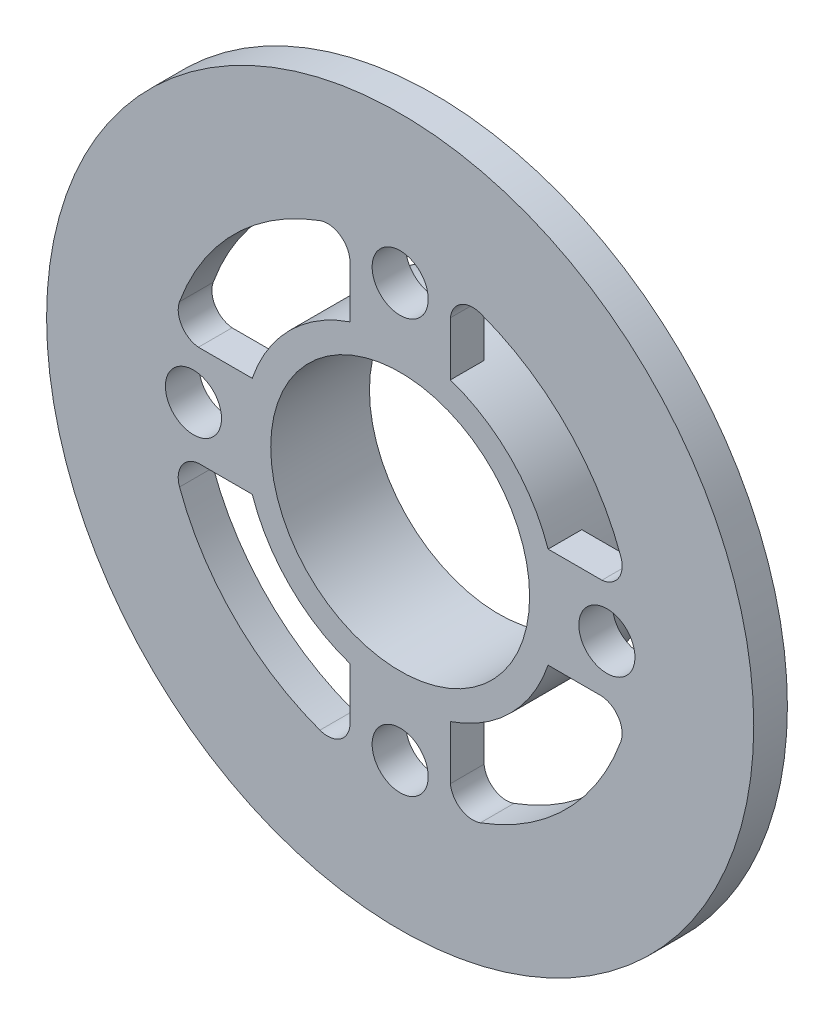
ISO-10303-21;
HEADER;
FILE_DESCRIPTION(('STEP AP214'),'2;1');
FILE_NAME('part.step','',(''),(''),'','','');
FILE_SCHEMA(('AUTOMOTIVE_DESIGN { 1 0 10303 214 1 1 1 1 }'));
ENDSEC;
DATA;
#1=APPLICATION_CONTEXT('core data for automotive mechanical design processes');
#2=APPLICATION_PROTOCOL_DEFINITION('international standard','automotive_design',2000,#1);
#3=PRODUCT_CONTEXT('',#1,'mechanical');
#4=PRODUCT('Part','Part','',(#3));
#5=PRODUCT_RELATED_PRODUCT_CATEGORY('part','',(#4));
#6=PRODUCT_DEFINITION_FORMATION('','',#4);
#7=PRODUCT_DEFINITION_CONTEXT('part definition',#1,'design');
#8=PRODUCT_DEFINITION('design','',#6,#7);
#9=PRODUCT_DEFINITION_SHAPE('','',#8);
#10=(LENGTH_UNIT() NAMED_UNIT(*) SI_UNIT(.MILLI.,.METRE.));
#11=(NAMED_UNIT(*) PLANE_ANGLE_UNIT() SI_UNIT($,.RADIAN.));
#12=(NAMED_UNIT(*) SI_UNIT($,.STERADIAN.) SOLID_ANGLE_UNIT());
#13=UNCERTAINTY_MEASURE_WITH_UNIT(LENGTH_MEASURE(1.E-05),#10,'distance_accuracy_value','');
#14=(GEOMETRIC_REPRESENTATION_CONTEXT(3) GLOBAL_UNCERTAINTY_ASSIGNED_CONTEXT((#13)) GLOBAL_UNIT_ASSIGNED_CONTEXT((#10,
#11,#12)) REPRESENTATION_CONTEXT('',''));
#15=CARTESIAN_POINT('',(0.,0.,0.));
#16=DIRECTION('',(0.,0.,1.));
#17=DIRECTION('',(1.,0.,0.));
#18=AXIS2_PLACEMENT_3D('',#15,#16,#17);
#19=CARTESIAN_POINT('',(0.,0.,3.));
#20=DIRECTION('',(0.,0.,1.));
#21=DIRECTION('',(1.,0.,0.));
#22=AXIS2_PLACEMENT_3D('',#19,#20,#21);
#23=PLANE('',#22);
#24=DIRECTION('',(0.,-1.,0.));
#25=VECTOR('',#24,1.);
#26=CARTESIAN_POINT('',(-4.47815058329456,17.9820921615691,3.));
#27=LINE('',#26,#25);
#28=CARTESIAN_POINT('',(-4.47815058329407,17.9820921615698,3.));
#29=VERTEX_POINT('',#28);
#30=CARTESIAN_POINT('',(-4.47815058329457,13.1852869651489,3.));
#31=VERTEX_POINT('',#30);
#32=EDGE_CURVE('E376',#29,#31,#27,.T.);
#33=ORIENTED_EDGE('',*,*,#32,.T.);
#34=CARTESIAN_POINT('',(0.,0.,3.));
#35=DIRECTION('',(0.,0.,1.));
#36=DIRECTION('',(1.,0.,0.));
#37=AXIS2_PLACEMENT_3D('',#34,#35,#36);
#38=CIRCLE('',#37,13.925);
#39=CARTESIAN_POINT('',(-13.1852869651494,4.47815058329461,3.));
#40=VERTEX_POINT('',#39);
#41=EDGE_CURVE('E462',#40,#31,#38,.F.);
#42=ORIENTED_EDGE('',*,*,#41,.F.);
#43=DIRECTION('',(-1.,0.,0.));
#44=VECTOR('',#43,1.);
#45=CARTESIAN_POINT('',(-17.9820921615696,4.47815058329293,3.));
#46=LINE('',#45,#44);
#47=CARTESIAN_POINT('',(-17.9820921615698,4.47815058329409,3.));
#48=VERTEX_POINT('',#47);
#49=EDGE_CURVE('E385',#40,#48,#46,.T.);
#50=ORIENTED_EDGE('',*,*,#49,.T.);
#51=CARTESIAN_POINT('',(-17.7852442333786,6.46843973142479,3.));
#52=DIRECTION('',(0.,0.,1.));
#53=DIRECTION('',(1.,0.,0.));
#54=AXIS2_PLACEMENT_3D('',#51,#52,#53);
#55=CIRCLE('',#54,2.);
#56=CARTESIAN_POINT('',(-19.6647944826127,7.15202649300205,3.));
#57=VERTEX_POINT('',#56);
#58=EDGE_CURVE('E325',#48,#57,#55,.F.);
#59=ORIENTED_EDGE('',*,*,#58,.T.);
#60=CARTESIAN_POINT('',(0.,0.,3.));
#61=DIRECTION('',(0.,0.,1.));
#62=DIRECTION('',(1.,0.,0.));
#63=AXIS2_PLACEMENT_3D('',#60,#61,#62);
#64=CIRCLE('',#63,20.925);
#65=CARTESIAN_POINT('',(-7.15202649300203,19.6647944826128,3.));
#66=VERTEX_POINT('',#65);
#67=EDGE_CURVE('E276',#66,#57,#64,.T.);
#68=ORIENTED_EDGE('',*,*,#67,.F.);
#69=CARTESIAN_POINT('',(-6.46843973142478,17.7852442333786,3.));
#70=DIRECTION('',(0.,0.,1.));
#71=DIRECTION('',(1.,0.,0.));
#72=AXIS2_PLACEMENT_3D('',#69,#70,#71);
#73=CIRCLE('',#72,2.);
#74=EDGE_CURVE('E44',#66,#29,#73,.F.);
#75=ORIENTED_EDGE('',*,*,#74,.T.);
#76=EDGE_LOOP('',(#33,#42,#50,#59,#68,#75));
#77=FACE_BOUND('',#76,.T.);
#78=DIRECTION('',(1.,0.,0.));
#79=VECTOR('',#78,1.);
#80=CARTESIAN_POINT('',(-17.9820921615696,-4.47815058329522,3.));
#81=LINE('',#80,#79);
#82=CARTESIAN_POINT('',(-17.9820921615698,-4.47815058329406,3.));
#83=VERTEX_POINT('',#82);
#84=CARTESIAN_POINT('',(-13.1852869651494,-4.47815058329523,3.));
#85=VERTEX_POINT('',#84);
#86=EDGE_CURVE('E390',#83,#85,#81,.T.);
#87=ORIENTED_EDGE('',*,*,#86,.T.);
#88=CARTESIAN_POINT('',(-4.47815058329266,-13.18528696515,3.));
#89=VERTEX_POINT('',#88);
#90=EDGE_CURVE('E219',#89,#85,#38,.F.);
#91=ORIENTED_EDGE('',*,*,#90,.F.);
#92=DIRECTION('',(0.,-1.,0.));
#93=VECTOR('',#92,1.);
#94=CARTESIAN_POINT('',(-4.47815058329341,-17.9820921615703,3.));
#95=LINE('',#94,#93);
#96=CARTESIAN_POINT('',(-4.47815058329406,-17.9820921615698,3.));
#97=VERTEX_POINT('',#96);
#98=EDGE_CURVE('E401',#89,#97,#95,.T.);
#99=ORIENTED_EDGE('',*,*,#98,.T.);
#100=CARTESIAN_POINT('',(-6.46843973142476,-17.7852442333786,3.));
#101=DIRECTION('',(0.,0.,1.));
#102=DIRECTION('',(1.,0.,0.));
#103=AXIS2_PLACEMENT_3D('',#100,#101,#102);
#104=CIRCLE('',#103,2.);
#105=CARTESIAN_POINT('',(-7.15202649300202,-19.6647944826128,3.));
#106=VERTEX_POINT('',#105);
#107=EDGE_CURVE('E329',#97,#106,#104,.F.);
#108=ORIENTED_EDGE('',*,*,#107,.T.);
#109=CARTESIAN_POINT('',(-19.6647944826128,-7.15202649300202,3.));
#110=VERTEX_POINT('',#109);
#111=EDGE_CURVE('E421',#110,#106,#64,.T.);
#112=ORIENTED_EDGE('',*,*,#111,.F.);
#113=CARTESIAN_POINT('',(-17.7852442333786,-6.46843973142476,3.));
#114=DIRECTION('',(0.,0.,1.));
#115=DIRECTION('',(1.,0.,0.));
#116=AXIS2_PLACEMENT_3D('',#113,#114,#115);
#117=CIRCLE('',#116,2.);
#118=EDGE_CURVE('E331',#110,#83,#117,.F.);
#119=ORIENTED_EDGE('',*,*,#118,.T.);
#120=EDGE_LOOP('',(#87,#91,#99,#108,#112,#119));
#121=FACE_BOUND('',#120,.T.);
#122=DIRECTION('',(0.,1.,0.));
#123=VECTOR('',#122,1.);
#124=CARTESIAN_POINT('',(4.47815058329474,-17.9820921615703,3.));
#125=LINE('',#124,#123);
#126=CARTESIAN_POINT('',(4.47815058329409,-17.9820921615698,3.));
#127=VERTEX_POINT('',#126);
#128=CARTESIAN_POINT('',(4.47815058329475,-13.18528696515,3.));
#129=VERTEX_POINT('',#128);
#130=EDGE_CURVE('E217',#127,#129,#125,.T.);
#131=ORIENTED_EDGE('',*,*,#130,.T.);
#132=CARTESIAN_POINT('',(13.1852869651496,-4.47815058329407,3.));
#133=VERTEX_POINT('',#132);
#134=EDGE_CURVE('E200',#133,#129,#38,.F.);
#135=ORIENTED_EDGE('',*,*,#134,.F.);
#136=DIRECTION('',(1.,0.,0.));
#137=VECTOR('',#136,1.);
#138=CARTESIAN_POINT('',(17.9820921615698,-4.47815058329407,3.));
#139=LINE('',#138,#137);
#140=CARTESIAN_POINT('',(17.9820921615698,-4.47815058329407,3.));
#141=VERTEX_POINT('',#140);
#142=EDGE_CURVE('E215',#133,#141,#139,.T.);
#143=ORIENTED_EDGE('',*,*,#142,.T.);
#144=CARTESIAN_POINT('',(17.7852442333786,-6.46843973142478,3.));
#145=DIRECTION('',(0.,0.,1.));
#146=DIRECTION('',(1.,0.,0.));
#147=AXIS2_PLACEMENT_3D('',#144,#145,#146);
#148=CIRCLE('',#147,2.);
#149=CARTESIAN_POINT('',(19.6647944826128,-7.15202649300203,3.));
#150=VERTEX_POINT('',#149);
#151=EDGE_CURVE('E341',#141,#150,#148,.F.);
#152=ORIENTED_EDGE('',*,*,#151,.T.);
#153=CARTESIAN_POINT('',(7.15202649300205,-19.6647944826127,3.));
#154=VERTEX_POINT('',#153);
#155=EDGE_CURVE('E275',#154,#150,#64,.T.);
#156=ORIENTED_EDGE('',*,*,#155,.F.);
#157=CARTESIAN_POINT('',(6.46843973142479,-17.7852442333786,3.));
#158=DIRECTION('',(0.,0.,1.));
#159=DIRECTION('',(1.,0.,0.));
#160=AXIS2_PLACEMENT_3D('',#157,#158,#159);
#161=CIRCLE('',#160,2.);
#162=EDGE_CURVE('E335',#154,#127,#161,.F.);
#163=ORIENTED_EDGE('',*,*,#162,.T.);
#164=EDGE_LOOP('',(#131,#135,#143,#152,#156,#163));
#165=FACE_BOUND('',#164,.T.);
#166=CARTESIAN_POINT('',(4.47815058329603,13.1852869651489,3.));
#167=VERTEX_POINT('',#166);
#168=CARTESIAN_POINT('',(13.1852869651496,4.47815058329407,3.));
#169=VERTEX_POINT('',#168);
#170=EDGE_CURVE('E221',#167,#169,#38,.F.);
#171=ORIENTED_EDGE('',*,*,#170,.F.);
#172=DIRECTION('',(0.,1.,0.));
#173=VECTOR('',#172,1.);
#174=CARTESIAN_POINT('',(4.47815058329359,17.9820921615691,3.));
#175=LINE('',#174,#173);
#176=CARTESIAN_POINT('',(4.47815058329407,17.9820921615698,3.));
#177=VERTEX_POINT('',#176);
#178=EDGE_CURVE('E354',#167,#177,#175,.T.);
#179=ORIENTED_EDGE('',*,*,#178,.T.);
#180=CARTESIAN_POINT('',(6.46843973142478,17.7852442333786,3.));
#181=DIRECTION('',(0.,0.,1.));
#182=DIRECTION('',(1.,0.,0.));
#183=AXIS2_PLACEMENT_3D('',#180,#181,#182);
#184=CIRCLE('',#183,2.);
#185=CARTESIAN_POINT('',(7.15202649300203,19.6647944826128,3.));
#186=VERTEX_POINT('',#185);
#187=EDGE_CURVE('E348',#177,#186,#184,.F.);
#188=ORIENTED_EDGE('',*,*,#187,.T.);
#189=CARTESIAN_POINT('',(19.6647944826128,7.15202649300203,3.));
#190=VERTEX_POINT('',#189);
#191=EDGE_CURVE('E271',#190,#186,#64,.T.);
#192=ORIENTED_EDGE('',*,*,#191,.F.);
#193=CARTESIAN_POINT('',(17.7852442333786,6.46843973142478,3.));
#194=DIRECTION('',(0.,0.,1.));
#195=DIRECTION('',(1.,0.,0.));
#196=AXIS2_PLACEMENT_3D('',#193,#194,#195);
#197=CIRCLE('',#196,2.);
#198=CARTESIAN_POINT('',(17.9820921615698,4.47815058329407,3.));
#199=VERTEX_POINT('',#198);
#200=EDGE_CURVE('E343',#190,#199,#197,.F.);
#201=ORIENTED_EDGE('',*,*,#200,.T.);
#202=DIRECTION('',(-1.,0.,0.));
#203=VECTOR('',#202,1.);
#204=CARTESIAN_POINT('',(17.9820921615698,4.47815058329407,3.));
#205=LINE('',#204,#203);
#206=EDGE_CURVE('E226',#199,#169,#205,.T.);
#207=ORIENTED_EDGE('',*,*,#206,.T.);
#208=EDGE_LOOP('',(#171,#179,#188,#192,#201,#207));
#209=FACE_BOUND('',#208,.T.);
#210=CARTESIAN_POINT('',(-18.425,0.,3.));
#211=DIRECTION('',(0.,0.,1.));
#212=DIRECTION('',(1.,0.,0.));
#213=AXIS2_PLACEMENT_3D('',#210,#211,#212);
#214=CIRCLE('',#213,2.5);
#215=CARTESIAN_POINT('',(-15.925,0.,3.));
#216=VERTEX_POINT('',#215);
#217=EDGE_CURVE('E243',#216,#216,#214,.F.);
#218=ORIENTED_EDGE('',*,*,#217,.T.);
#219=EDGE_LOOP('',(#218));
#220=FACE_BOUND('',#219,.T.);
#221=CARTESIAN_POINT('',(0.,-18.425,3.));
#222=DIRECTION('',(0.,0.,1.));
#223=DIRECTION('',(1.,0.,0.));
#224=AXIS2_PLACEMENT_3D('',#221,#222,#223);
#225=CIRCLE('',#224,2.5);
#226=CARTESIAN_POINT('',(2.50000000000001,-18.425,3.));
#227=VERTEX_POINT('',#226);
#228=EDGE_CURVE('E249',#227,#227,#225,.F.);
#229=ORIENTED_EDGE('',*,*,#228,.T.);
#230=EDGE_LOOP('',(#229));
#231=FACE_BOUND('',#230,.T.);
#232=CARTESIAN_POINT('',(18.425,0.,3.));
#233=DIRECTION('',(0.,0.,1.));
#234=DIRECTION('',(1.,0.,0.));
#235=AXIS2_PLACEMENT_3D('',#232,#233,#234);
#236=CIRCLE('',#235,2.5);
#237=CARTESIAN_POINT('',(20.925,0.,3.));
#238=VERTEX_POINT('',#237);
#239=EDGE_CURVE('E255',#238,#238,#236,.F.);
#240=ORIENTED_EDGE('',*,*,#239,.T.);
#241=EDGE_LOOP('',(#240));
#242=FACE_BOUND('',#241,.T.);
#243=CARTESIAN_POINT('',(0.,18.425,3.));
#244=DIRECTION('',(0.,0.,1.));
#245=DIRECTION('',(1.,0.,0.));
#246=AXIS2_PLACEMENT_3D('',#243,#244,#245);
#247=CIRCLE('',#246,2.5);
#248=CARTESIAN_POINT('',(2.5,18.425,3.));
#249=VERTEX_POINT('',#248);
#250=EDGE_CURVE('E264',#249,#249,#247,.F.);
#251=ORIENTED_EDGE('',*,*,#250,.T.);
#252=EDGE_LOOP('',(#251));
#253=FACE_BOUND('',#252,.T.);
#254=CARTESIAN_POINT('',(0.,0.,3.));
#255=DIRECTION('',(0.,0.,1.));
#256=DIRECTION('',(1.,0.,0.));
#257=AXIS2_PLACEMENT_3D('',#254,#255,#256);
#258=CIRCLE('',#257,31.5158134389242);
#259=CARTESIAN_POINT('',(31.5158134389242,0.,3.));
#260=VERTEX_POINT('',#259);
#261=EDGE_CURVE('E240',#260,#260,#258,.T.);
#262=ORIENTED_EDGE('',*,*,#261,.T.);
#263=EDGE_LOOP('',(#262));
#264=FACE_BOUND('',#263,.T.);
#265=CARTESIAN_POINT('',(0.,0.,3.));
#266=DIRECTION('',(0.,0.,1.));
#267=DIRECTION('',(1.,0.,0.));
#268=AXIS2_PLACEMENT_3D('',#265,#266,#267);
#269=CIRCLE('',#268,11.5377872077873);
#270=CARTESIAN_POINT('',(11.5377872077873,0.,3.));
#271=VERTEX_POINT('',#270);
#272=EDGE_CURVE('E218',#271,#271,#269,.F.);
#273=ORIENTED_EDGE('',*,*,#272,.T.);
#274=EDGE_LOOP('',(#273));
#275=FACE_BOUND('',#274,.T.);
#276=ADVANCED_FACE('F36',(#77,#121,#165,#209,#220,#231,#242,#253,#264,#275),#23,.T.);
#277=CARTESIAN_POINT('',(0.,0.,0.));
#278=DIRECTION('',(0.,0.,1.));
#279=DIRECTION('',(1.,0.,0.));
#280=AXIS2_PLACEMENT_3D('',#277,#278,#279);
#281=PLANE('',#280);
#282=DIRECTION('',(0.,-1.,0.));
#283=VECTOR('',#282,1.);
#284=CARTESIAN_POINT('',(4.47815058329359,17.9820921615691,0.));
#285=LINE('',#284,#283);
#286=CARTESIAN_POINT('',(4.47815058329407,17.9820921615698,0.));
#287=VERTEX_POINT('',#286);
#288=CARTESIAN_POINT('',(4.47815058329603,13.1852869651489,0.));
#289=VERTEX_POINT('',#288);
#290=EDGE_CURVE('E364',#287,#289,#285,.T.);
#291=ORIENTED_EDGE('',*,*,#290,.T.);
#292=CARTESIAN_POINT('',(0.,0.,0.));
#293=DIRECTION('',(0.,0.,1.));
#294=DIRECTION('',(1.,0.,0.));
#295=AXIS2_PLACEMENT_3D('',#292,#293,#294);
#296=CIRCLE('',#295,13.925);
#297=CARTESIAN_POINT('',(-4.47815058329457,13.1852869651494,0.));
#298=VERTEX_POINT('',#297);
#299=EDGE_CURVE('E455',#289,#298,#296,.T.);
#300=ORIENTED_EDGE('',*,*,#299,.T.);
#301=DIRECTION('',(0.,1.,0.));
#302=VECTOR('',#301,1.);
#303=CARTESIAN_POINT('',(-4.47815058329456,17.9820921615691,0.));
#304=LINE('',#303,#302);
#305=CARTESIAN_POINT('',(-4.47815058329456,17.9820921615691,0.));
#306=VERTEX_POINT('',#305);
#307=EDGE_CURVE('E368',#298,#306,#304,.T.);
#308=ORIENTED_EDGE('',*,*,#307,.T.);
#309=CARTESIAN_POINT('',(-6.46843973142478,17.7852442333786,0.));
#310=DIRECTION('',(0.,0.,1.));
#311=DIRECTION('',(1.,0.,0.));
#312=AXIS2_PLACEMENT_3D('',#309,#310,#311);
#313=CIRCLE('',#312,2.);
#314=CARTESIAN_POINT('',(-7.15202649300203,19.6647944826128,0.));
#315=VERTEX_POINT('',#314);
#316=EDGE_CURVE('E11',#306,#315,#313,.T.);
#317=ORIENTED_EDGE('',*,*,#316,.T.);
#318=CARTESIAN_POINT('',(0.,0.,0.));
#319=DIRECTION('',(0.,0.,-1.));
#320=DIRECTION('',(-1.,0.,0.));
#321=AXIS2_PLACEMENT_3D('',#318,#319,#320);
#322=CIRCLE('',#321,20.925);
#323=CARTESIAN_POINT('',(-19.6647944826127,7.15202649300205,0.));
#324=VERTEX_POINT('',#323);
#325=EDGE_CURVE('E267',#324,#315,#322,.T.);
#326=ORIENTED_EDGE('',*,*,#325,.F.);
#327=CARTESIAN_POINT('',(-17.7852442333786,6.46843973142479,0.));
#328=DIRECTION('',(0.,0.,1.));
#329=DIRECTION('',(1.,0.,0.));
#330=AXIS2_PLACEMENT_3D('',#327,#328,#329);
#331=CIRCLE('',#330,2.);
#332=CARTESIAN_POINT('',(-17.9820921615698,4.47815058329409,0.));
#333=VERTEX_POINT('',#332);
#334=EDGE_CURVE('E323',#324,#333,#331,.T.);
#335=ORIENTED_EDGE('',*,*,#334,.T.);
#336=DIRECTION('',(1.,0.,0.));
#337=VECTOR('',#336,1.);
#338=CARTESIAN_POINT('',(-17.9820921615696,4.47815058329293,0.));
#339=LINE('',#338,#337);
#340=CARTESIAN_POINT('',(-13.1852869651494,4.47815058329461,0.));
#341=VERTEX_POINT('',#340);
#342=EDGE_CURVE('E381',#333,#341,#339,.T.);
#343=ORIENTED_EDGE('',*,*,#342,.T.);
#344=CARTESIAN_POINT('',(-13.1852869651492,-4.47815058329523,0.));
#345=VERTEX_POINT('',#344);
#346=EDGE_CURVE('E453',#341,#345,#296,.T.);
#347=ORIENTED_EDGE('',*,*,#346,.T.);
#348=DIRECTION('',(-1.,0.,0.));
#349=VECTOR('',#348,1.);
#350=CARTESIAN_POINT('',(-17.9820921615696,-4.47815058329522,0.));
#351=LINE('',#350,#349);
#352=CARTESIAN_POINT('',(-17.9820921615696,-4.47815058329522,0.));
#353=VERTEX_POINT('',#352);
#354=EDGE_CURVE('E378',#345,#353,#351,.T.);
#355=ORIENTED_EDGE('',*,*,#354,.T.);
#356=CARTESIAN_POINT('',(-17.7852442333786,-6.46843973142476,0.));
#357=DIRECTION('',(0.,0.,1.));
#358=DIRECTION('',(1.,0.,0.));
#359=AXIS2_PLACEMENT_3D('',#356,#357,#358);
#360=CIRCLE('',#359,2.);
#361=CARTESIAN_POINT('',(-19.6647944826128,-7.15202649300202,0.));
#362=VERTEX_POINT('',#361);
#363=EDGE_CURVE('E333',#353,#362,#360,.T.);
#364=ORIENTED_EDGE('',*,*,#363,.T.);
#365=CARTESIAN_POINT('',(-7.15202649300202,-19.6647944826128,0.));
#366=VERTEX_POINT('',#365);
#367=EDGE_CURVE('E439',#366,#362,#322,.T.);
#368=ORIENTED_EDGE('',*,*,#367,.F.);
#369=CARTESIAN_POINT('',(-6.46843973142476,-17.7852442333786,0.));
#370=DIRECTION('',(0.,0.,1.));
#371=DIRECTION('',(1.,0.,0.));
#372=AXIS2_PLACEMENT_3D('',#369,#370,#371);
#373=CIRCLE('',#372,2.);
#374=CARTESIAN_POINT('',(-4.47815058329406,-17.9820921615698,0.));
#375=VERTEX_POINT('',#374);
#376=EDGE_CURVE('E327',#366,#375,#373,.T.);
#377=ORIENTED_EDGE('',*,*,#376,.T.);
#378=DIRECTION('',(0.,1.,0.));
#379=VECTOR('',#378,1.);
#380=CARTESIAN_POINT('',(-4.47815058329341,-17.9820921615703,0.));
#381=LINE('',#380,#379);
#382=CARTESIAN_POINT('',(-4.47815058329341,-13.1852869651498,0.));
#383=VERTEX_POINT('',#382);
#384=EDGE_CURVE('E398',#375,#383,#381,.T.);
#385=ORIENTED_EDGE('',*,*,#384,.T.);
#386=CARTESIAN_POINT('',(4.47815058329475,-13.1852869651493,0.));
#387=VERTEX_POINT('',#386);
#388=EDGE_CURVE('E450',#383,#387,#296,.T.);
#389=ORIENTED_EDGE('',*,*,#388,.T.);
#390=DIRECTION('',(0.,-1.,0.));
#391=VECTOR('',#390,1.);
#392=CARTESIAN_POINT('',(4.47815058329474,-17.9820921615703,0.));
#393=LINE('',#392,#391);
#394=CARTESIAN_POINT('',(4.47815058329474,-17.9820921615703,0.));
#395=VERTEX_POINT('',#394);
#396=EDGE_CURVE('E393',#387,#395,#393,.T.);
#397=ORIENTED_EDGE('',*,*,#396,.T.);
#398=CARTESIAN_POINT('',(6.46843973142479,-17.7852442333786,0.));
#399=DIRECTION('',(0.,0.,1.));
#400=DIRECTION('',(1.,0.,0.));
#401=AXIS2_PLACEMENT_3D('',#398,#399,#400);
#402=CIRCLE('',#401,2.);
#403=CARTESIAN_POINT('',(7.15202649300205,-19.6647944826127,0.));
#404=VERTEX_POINT('',#403);
#405=EDGE_CURVE('E337',#395,#404,#402,.T.);
#406=ORIENTED_EDGE('',*,*,#405,.T.);
#407=CARTESIAN_POINT('',(19.6647944826128,-7.15202649300203,0.));
#408=VERTEX_POINT('',#407);
#409=EDGE_CURVE('E272',#408,#404,#322,.T.);
#410=ORIENTED_EDGE('',*,*,#409,.F.);
#411=CARTESIAN_POINT('',(17.7852442333786,-6.46843973142478,0.));
#412=DIRECTION('',(0.,0.,1.));
#413=DIRECTION('',(1.,0.,0.));
#414=AXIS2_PLACEMENT_3D('',#411,#412,#413);
#415=CIRCLE('',#414,2.);
#416=CARTESIAN_POINT('',(17.9820921615698,-4.47815058329407,0.));
#417=VERTEX_POINT('',#416);
#418=EDGE_CURVE('E339',#408,#417,#415,.T.);
#419=ORIENTED_EDGE('',*,*,#418,.T.);
#420=DIRECTION('',(-1.,0.,0.));
#421=VECTOR('',#420,1.);
#422=CARTESIAN_POINT('',(17.9820921615698,-4.47815058329407,0.));
#423=LINE('',#422,#421);
#424=CARTESIAN_POINT('',(13.1852869651496,-4.47815058329407,0.));
#425=VERTEX_POINT('',#424);
#426=EDGE_CURVE('E208',#417,#425,#423,.T.);
#427=ORIENTED_EDGE('',*,*,#426,.T.);
#428=CARTESIAN_POINT('',(13.1852869651496,4.47815058329407,0.));
#429=VERTEX_POINT('',#428);
#430=EDGE_CURVE('E203',#425,#429,#296,.T.);
#431=ORIENTED_EDGE('',*,*,#430,.T.);
#432=DIRECTION('',(1.,0.,0.));
#433=VECTOR('',#432,1.);
#434=CARTESIAN_POINT('',(17.9820921615698,4.47815058329407,0.));
#435=LINE('',#434,#433);
#436=CARTESIAN_POINT('',(17.9820921615698,4.47815058329407,0.));
#437=VERTEX_POINT('',#436);
#438=EDGE_CURVE('E234',#429,#437,#435,.T.);
#439=ORIENTED_EDGE('',*,*,#438,.T.);
#440=CARTESIAN_POINT('',(17.7852442333786,6.46843973142478,0.));
#441=DIRECTION('',(0.,0.,1.));
#442=DIRECTION('',(1.,0.,0.));
#443=AXIS2_PLACEMENT_3D('',#440,#441,#442);
#444=CIRCLE('',#443,2.);
#445=CARTESIAN_POINT('',(19.6647944826128,7.15202649300203,0.));
#446=VERTEX_POINT('',#445);
#447=EDGE_CURVE('E345',#437,#446,#444,.T.);
#448=ORIENTED_EDGE('',*,*,#447,.T.);
#449=CARTESIAN_POINT('',(7.15202649300203,19.6647944826128,0.));
#450=VERTEX_POINT('',#449);
#451=EDGE_CURVE('E268',#450,#446,#322,.T.);
#452=ORIENTED_EDGE('',*,*,#451,.F.);
#453=CARTESIAN_POINT('',(6.46843973142478,17.7852442333786,0.));
#454=DIRECTION('',(0.,0.,1.));
#455=DIRECTION('',(1.,0.,0.));
#456=AXIS2_PLACEMENT_3D('',#453,#454,#455);
#457=CIRCLE('',#456,2.);
#458=EDGE_CURVE('E51',#450,#287,#457,.T.);
#459=ORIENTED_EDGE('',*,*,#458,.T.);
#460=EDGE_LOOP('',(#291,#300,#308,#317,#326,#335,#343,#347,#355,#364,#368,#377,#385,#389,#397,
#406,#410,#419,#427,#431,#439,#448,#452,#459));
#461=FACE_BOUND('',#460,.T.);
#462=CARTESIAN_POINT('',(-18.425,0.,0.));
#463=DIRECTION('',(0.,0.,-1.));
#464=DIRECTION('',(1.,0.,0.));
#465=AXIS2_PLACEMENT_3D('',#462,#463,#464);
#466=CIRCLE('',#465,2.5);
#467=CARTESIAN_POINT('',(-15.925,0.,0.));
#468=VERTEX_POINT('',#467);
#469=EDGE_CURVE('E246',#468,#468,#466,.T.);
#470=ORIENTED_EDGE('',*,*,#469,.F.);
#471=EDGE_LOOP('',(#470));
#472=FACE_BOUND('',#471,.T.);
#473=CARTESIAN_POINT('',(0.,-18.425,0.));
#474=DIRECTION('',(0.,0.,-1.));
#475=DIRECTION('',(1.,0.,0.));
#476=AXIS2_PLACEMENT_3D('',#473,#474,#475);
#477=CIRCLE('',#476,2.5);
#478=CARTESIAN_POINT('',(2.50000000000001,-18.425,0.));
#479=VERTEX_POINT('',#478);
#480=EDGE_CURVE('E252',#479,#479,#477,.T.);
#481=ORIENTED_EDGE('',*,*,#480,.F.);
#482=EDGE_LOOP('',(#481));
#483=FACE_BOUND('',#482,.T.);
#484=CARTESIAN_POINT('',(18.425,0.,0.));
#485=DIRECTION('',(0.,0.,-1.));
#486=DIRECTION('',(-1.,0.,0.));
#487=AXIS2_PLACEMENT_3D('',#484,#485,#486);
#488=CIRCLE('',#487,2.5);
#489=CARTESIAN_POINT('',(15.925,0.,0.));
#490=VERTEX_POINT('',#489);
#491=EDGE_CURVE('E258',#490,#490,#488,.T.);
#492=ORIENTED_EDGE('',*,*,#491,.F.);
#493=EDGE_LOOP('',(#492));
#494=FACE_BOUND('',#493,.T.);
#495=CARTESIAN_POINT('',(0.,18.425,0.));
#496=DIRECTION('',(0.,0.,-1.));
#497=DIRECTION('',(-1.,0.,0.));
#498=AXIS2_PLACEMENT_3D('',#495,#496,#497);
#499=CIRCLE('',#498,2.5);
#500=CARTESIAN_POINT('',(-2.5,18.425,0.));
#501=VERTEX_POINT('',#500);
#502=EDGE_CURVE('E261',#501,#501,#499,.T.);
#503=ORIENTED_EDGE('',*,*,#502,.F.);
#504=EDGE_LOOP('',(#503));
#505=FACE_BOUND('',#504,.T.);
#506=CARTESIAN_POINT('',(0.,0.,0.));
#507=DIRECTION('',(0.,0.,-1.));
#508=DIRECTION('',(-1.,0.,0.));
#509=AXIS2_PLACEMENT_3D('',#506,#507,#508);
#510=CIRCLE('',#509,31.5158134389242);
#511=CARTESIAN_POINT('',(-31.5158134389242,0.,0.));
#512=VERTEX_POINT('',#511);
#513=EDGE_CURVE('E237',#512,#512,#510,.T.);
#514=ORIENTED_EDGE('',*,*,#513,.T.);
#515=EDGE_LOOP('',(#514));
#516=FACE_BOUND('',#515,.T.);
#517=ADVANCED_FACE('F408',(#461,#472,#483,#494,#505,#516),#281,.F.);
#518=CARTESIAN_POINT('',(0.,0.,9.));
#519=DIRECTION('',(0.,0.,-1.));
#520=DIRECTION('',(-1.,0.,0.));
#521=AXIS2_PLACEMENT_3D('',#518,#519,#520);
#522=CYLINDRICAL_SURFACE('',#521,20.925);
#523=ORIENTED_EDGE('',*,*,#111,.T.);
#524=DIRECTION('',(0.,0.,-1.));
#525=VECTOR('',#524,1.);
#526=CARTESIAN_POINT('',(-7.15202649300202,-19.6647944826128,9.));
#527=LINE('',#526,#525);
#528=EDGE_CURVE('E292',#106,#366,#527,.T.);
#529=ORIENTED_EDGE('',*,*,#528,.T.);
#530=ORIENTED_EDGE('',*,*,#367,.T.);
#531=DIRECTION('',(0.,0.,-1.));
#532=VECTOR('',#531,1.);
#533=CARTESIAN_POINT('',(-19.6647944826128,-7.15202649300202,9.));
#534=LINE('',#533,#532);
#535=EDGE_CURVE('E289',#362,#110,#534,.F.);
#536=ORIENTED_EDGE('',*,*,#535,.T.);
#537=EDGE_LOOP('',(#523,#529,#530,#536));
#538=FACE_BOUND('',#537,.T.);
#539=ADVANCED_FACE('F492',(#538),#522,.F.);
#540=ORIENTED_EDGE('',*,*,#409,.T.);
#541=DIRECTION('',(0.,0.,-1.));
#542=VECTOR('',#541,1.);
#543=CARTESIAN_POINT('',(7.15202649300205,-19.6647944826128,9.));
#544=LINE('',#543,#542);
#545=EDGE_CURVE('E304',#404,#154,#544,.F.);
#546=ORIENTED_EDGE('',*,*,#545,.T.);
#547=ORIENTED_EDGE('',*,*,#155,.T.);
#548=DIRECTION('',(0.,0.,-1.));
#549=VECTOR('',#548,1.);
#550=CARTESIAN_POINT('',(19.6647944826128,-7.15202649300203,9.));
#551=LINE('',#550,#549);
#552=EDGE_CURVE('E301',#150,#408,#551,.T.);
#553=ORIENTED_EDGE('',*,*,#552,.T.);
#554=EDGE_LOOP('',(#540,#546,#547,#553));
#555=FACE_BOUND('',#554,.T.);
#556=ADVANCED_FACE('F419',(#555),#522,.F.);
#557=ORIENTED_EDGE('',*,*,#451,.T.);
#558=DIRECTION('',(0.,0.,-1.));
#559=VECTOR('',#558,1.);
#560=CARTESIAN_POINT('',(19.6647944826128,7.15202649300203,9.));
#561=LINE('',#560,#559);
#562=EDGE_CURVE('E314',#446,#190,#561,.F.);
#563=ORIENTED_EDGE('',*,*,#562,.T.);
#564=ORIENTED_EDGE('',*,*,#191,.T.);
#565=DIRECTION('',(0.,0.,-1.));
#566=VECTOR('',#565,1.);
#567=CARTESIAN_POINT('',(7.15202649300203,19.6647944826128,9.));
#568=LINE('',#567,#566);
#569=EDGE_CURVE('E311',#186,#450,#568,.T.);
#570=ORIENTED_EDGE('',*,*,#569,.T.);
#571=EDGE_LOOP('',(#557,#563,#564,#570));
#572=FACE_BOUND('',#571,.T.);
#573=ADVANCED_FACE('F358',(#572),#522,.F.);
#574=ORIENTED_EDGE('',*,*,#67,.T.);
#575=DIRECTION('',(0.,0.,-1.));
#576=VECTOR('',#575,1.);
#577=CARTESIAN_POINT('',(-19.6647944826128,7.15202649300205,9.));
#578=LINE('',#577,#576);
#579=EDGE_CURVE('E280',#57,#324,#578,.T.);
#580=ORIENTED_EDGE('',*,*,#579,.T.);
#581=ORIENTED_EDGE('',*,*,#325,.T.);
#582=DIRECTION('',(0.,0.,-1.));
#583=VECTOR('',#582,1.);
#584=CARTESIAN_POINT('',(-7.15202649300203,19.6647944826128,9.));
#585=LINE('',#584,#583);
#586=EDGE_CURVE('E277',#315,#66,#585,.F.);
#587=ORIENTED_EDGE('',*,*,#586,.T.);
#588=EDGE_LOOP('',(#574,#580,#581,#587));
#589=FACE_BOUND('',#588,.T.);
#590=ADVANCED_FACE('F429',(#589),#522,.F.);
#591=CARTESIAN_POINT('',(0.,18.425,15.7279220613579));
#592=DIRECTION('',(0.,0.,-1.));
#593=DIRECTION('',(-1.,0.,0.));
#594=AXIS2_PLACEMENT_3D('',#591,#592,#593);
#595=CYLINDRICAL_SURFACE('',#594,2.5);
#596=ORIENTED_EDGE('',*,*,#502,.T.);
#597=EDGE_LOOP('',(#596));
#598=FACE_BOUND('',#597,.T.);
#599=ORIENTED_EDGE('',*,*,#250,.F.);
#600=EDGE_LOOP('',(#599));
#601=FACE_BOUND('',#600,.T.);
#602=ADVANCED_FACE('F544',(#598,#601),#595,.F.);
#603=CARTESIAN_POINT('',(18.425,0.,15.7279220613579));
#604=DIRECTION('',(0.,0.,-1.));
#605=DIRECTION('',(-1.,0.,0.));
#606=AXIS2_PLACEMENT_3D('',#603,#604,#605);
#607=CYLINDRICAL_SURFACE('',#606,2.5);
#608=ORIENTED_EDGE('',*,*,#491,.T.);
#609=EDGE_LOOP('',(#608));
#610=FACE_BOUND('',#609,.T.);
#611=ORIENTED_EDGE('',*,*,#239,.F.);
#612=EDGE_LOOP('',(#611));
#613=FACE_BOUND('',#612,.T.);
#614=ADVANCED_FACE('F541',(#610,#613),#607,.F.);
#615=CARTESIAN_POINT('',(0.,-18.425,15.7279220613579));
#616=DIRECTION('',(0.,0.,-1.));
#617=DIRECTION('',(-1.,0.,0.));
#618=AXIS2_PLACEMENT_3D('',#615,#616,#617);
#619=CYLINDRICAL_SURFACE('',#618,2.5);
#620=ORIENTED_EDGE('',*,*,#480,.T.);
#621=EDGE_LOOP('',(#620));
#622=FACE_BOUND('',#621,.T.);
#623=ORIENTED_EDGE('',*,*,#228,.F.);
#624=EDGE_LOOP('',(#623));
#625=FACE_BOUND('',#624,.T.);
#626=ADVANCED_FACE('F537',(#622,#625),#619,.F.);
#627=CARTESIAN_POINT('',(-18.425,0.,15.7279220613579));
#628=DIRECTION('',(0.,0.,-1.));
#629=DIRECTION('',(-1.,0.,0.));
#630=AXIS2_PLACEMENT_3D('',#627,#628,#629);
#631=CYLINDRICAL_SURFACE('',#630,2.5);
#632=ORIENTED_EDGE('',*,*,#469,.T.);
#633=EDGE_LOOP('',(#632));
#634=FACE_BOUND('',#633,.T.);
#635=ORIENTED_EDGE('',*,*,#217,.F.);
#636=EDGE_LOOP('',(#635));
#637=FACE_BOUND('',#636,.T.);
#638=ADVANCED_FACE('F500',(#634,#637),#631,.F.);
#639=CARTESIAN_POINT('',(-17.7852442333786,6.46843973142479,15.7279220613579));
#640=DIRECTION('',(0.,0.,-1.));
#641=DIRECTION('',(-1.,0.,0.));
#642=AXIS2_PLACEMENT_3D('',#639,#640,#641);
#643=CYLINDRICAL_SURFACE('',#642,2.);
#644=ORIENTED_EDGE('',*,*,#58,.F.);
#645=DIRECTION('',(0.,0.,-1.));
#646=VECTOR('',#645,1.);
#647=CARTESIAN_POINT('',(-17.9820921615698,4.47815058329409,15.7279220613579));
#648=LINE('',#647,#646);
#649=EDGE_CURVE('E286',#333,#48,#648,.F.);
#650=ORIENTED_EDGE('',*,*,#649,.F.);
#651=ORIENTED_EDGE('',*,*,#334,.F.);
#652=ORIENTED_EDGE('',*,*,#579,.F.);
#653=EDGE_LOOP('',(#644,#650,#651,#652));
#654=FACE_BOUND('',#653,.T.);
#655=ADVANCED_FACE('F434',(#654),#643,.F.);
#656=CARTESIAN_POINT('',(-6.46843973142476,-17.7852442333786,15.7279220613579));
#657=DIRECTION('',(0.,0.,-1.));
#658=DIRECTION('',(-1.,0.,0.));
#659=AXIS2_PLACEMENT_3D('',#656,#657,#658);
#660=CYLINDRICAL_SURFACE('',#659,2.);
#661=ORIENTED_EDGE('',*,*,#107,.F.);
#662=DIRECTION('',(0.,0.,-1.));
#663=VECTOR('',#662,1.);
#664=CARTESIAN_POINT('',(-4.47815058329406,-17.9820921615698,15.7279220613579));
#665=LINE('',#664,#663);
#666=EDGE_CURVE('E298',#375,#97,#665,.F.);
#667=ORIENTED_EDGE('',*,*,#666,.F.);
#668=ORIENTED_EDGE('',*,*,#376,.F.);
#669=ORIENTED_EDGE('',*,*,#528,.F.);
#670=EDGE_LOOP('',(#661,#667,#668,#669));
#671=FACE_BOUND('',#670,.T.);
#672=ADVANCED_FACE('F499',(#671),#660,.F.);
#673=CARTESIAN_POINT('',(-17.7852442333786,-6.46843973142476,15.7279220613579));
#674=DIRECTION('',(0.,0.,1.));
#675=DIRECTION('',(1.,0.,0.));
#676=AXIS2_PLACEMENT_3D('',#673,#674,#675);
#677=CYLINDRICAL_SURFACE('',#676,2.);
#678=ORIENTED_EDGE('',*,*,#363,.F.);
#679=DIRECTION('',(0.,0.,-1.));
#680=VECTOR('',#679,1.);
#681=CARTESIAN_POINT('',(-17.9820921615698,-4.47815058329406,15.7279220613579));
#682=LINE('',#681,#680);
#683=EDGE_CURVE('E283',#83,#353,#682,.T.);
#684=ORIENTED_EDGE('',*,*,#683,.F.);
#685=ORIENTED_EDGE('',*,*,#118,.F.);
#686=ORIENTED_EDGE('',*,*,#535,.F.);
#687=EDGE_LOOP('',(#678,#684,#685,#686));
#688=FACE_BOUND('',#687,.T.);
#689=ADVANCED_FACE('F503',(#688),#677,.F.);
#690=CARTESIAN_POINT('',(6.46843973142479,-17.7852442333786,15.7279220613579));
#691=DIRECTION('',(0.,0.,1.));
#692=DIRECTION('',(1.,0.,0.));
#693=AXIS2_PLACEMENT_3D('',#690,#691,#692);
#694=CYLINDRICAL_SURFACE('',#693,2.);
#695=ORIENTED_EDGE('',*,*,#405,.F.);
#696=DIRECTION('',(0.,0.,-1.));
#697=VECTOR('',#696,1.);
#698=CARTESIAN_POINT('',(4.47815058329409,-17.9820921615698,15.7279220613579));
#699=LINE('',#698,#697);
#700=EDGE_CURVE('E295',#127,#395,#699,.T.);
#701=ORIENTED_EDGE('',*,*,#700,.F.);
#702=ORIENTED_EDGE('',*,*,#162,.F.);
#703=ORIENTED_EDGE('',*,*,#545,.F.);
#704=EDGE_LOOP('',(#695,#701,#702,#703));
#705=FACE_BOUND('',#704,.T.);
#706=ADVANCED_FACE('F444',(#705),#694,.F.);
#707=CARTESIAN_POINT('',(17.7852442333786,-6.46843973142478,15.7279220613579));
#708=DIRECTION('',(0.,0.,-1.));
#709=DIRECTION('',(-1.,0.,0.));
#710=AXIS2_PLACEMENT_3D('',#707,#708,#709);
#711=CYLINDRICAL_SURFACE('',#710,2.);
#712=ORIENTED_EDGE('',*,*,#151,.F.);
#713=DIRECTION('',(0.,0.,-1.));
#714=VECTOR('',#713,1.);
#715=CARTESIAN_POINT('',(17.9820921615698,-4.47815058329407,15.7279220613579));
#716=LINE('',#715,#714);
#717=EDGE_CURVE('E225',#417,#141,#716,.F.);
#718=ORIENTED_EDGE('',*,*,#717,.F.);
#719=ORIENTED_EDGE('',*,*,#418,.F.);
#720=ORIENTED_EDGE('',*,*,#552,.F.);
#721=EDGE_LOOP('',(#712,#718,#719,#720));
#722=FACE_BOUND('',#721,.T.);
#723=ADVANCED_FACE('F415',(#722),#711,.F.);
#724=CARTESIAN_POINT('',(17.7852442333786,6.46843973142478,15.7279220613579));
#725=DIRECTION('',(0.,0.,1.));
#726=DIRECTION('',(1.,0.,0.));
#727=AXIS2_PLACEMENT_3D('',#724,#725,#726);
#728=CYLINDRICAL_SURFACE('',#727,2.);
#729=ORIENTED_EDGE('',*,*,#447,.F.);
#730=DIRECTION('',(0.,0.,-1.));
#731=VECTOR('',#730,1.);
#732=CARTESIAN_POINT('',(17.9820921615698,4.47815058329407,15.7279220613579));
#733=LINE('',#732,#731);
#734=EDGE_CURVE('E307',#199,#437,#733,.T.);
#735=ORIENTED_EDGE('',*,*,#734,.F.);
#736=ORIENTED_EDGE('',*,*,#200,.F.);
#737=ORIENTED_EDGE('',*,*,#562,.F.);
#738=EDGE_LOOP('',(#729,#735,#736,#737));
#739=FACE_BOUND('',#738,.T.);
#740=ADVANCED_FACE('F512',(#739),#728,.F.);
#741=CARTESIAN_POINT('',(6.46843973142478,17.7852442333786,15.7279220613579));
#742=DIRECTION('',(0.,0.,-1.));
#743=DIRECTION('',(-1.,0.,0.));
#744=AXIS2_PLACEMENT_3D('',#741,#742,#743);
#745=CYLINDRICAL_SURFACE('',#744,2.);
#746=ORIENTED_EDGE('',*,*,#187,.F.);
#747=DIRECTION('',(0.,0.,-1.));
#748=VECTOR('',#747,1.);
#749=CARTESIAN_POINT('',(4.47815058329407,17.9820921615698,15.7279220613579));
#750=LINE('',#749,#748);
#751=EDGE_CURVE('E320',#287,#177,#750,.F.);
#752=ORIENTED_EDGE('',*,*,#751,.F.);
#753=ORIENTED_EDGE('',*,*,#458,.F.);
#754=ORIENTED_EDGE('',*,*,#569,.F.);
#755=EDGE_LOOP('',(#746,#752,#753,#754));
#756=FACE_BOUND('',#755,.T.);
#757=ADVANCED_FACE('F360',(#756),#745,.F.);
#758=CARTESIAN_POINT('',(-6.46843973142478,17.7852442333786,15.7279220613579));
#759=DIRECTION('',(0.,0.,1.));
#760=DIRECTION('',(1.,0.,0.));
#761=AXIS2_PLACEMENT_3D('',#758,#759,#760);
#762=CYLINDRICAL_SURFACE('',#761,2.);
#763=ORIENTED_EDGE('',*,*,#316,.F.);
#764=DIRECTION('',(0.,0.,-1.));
#765=VECTOR('',#764,1.);
#766=CARTESIAN_POINT('',(-4.47815058329407,17.9820921615698,15.7279220613579));
#767=LINE('',#766,#765);
#768=EDGE_CURVE('E317',#29,#306,#767,.T.);
#769=ORIENTED_EDGE('',*,*,#768,.F.);
#770=ORIENTED_EDGE('',*,*,#74,.F.);
#771=ORIENTED_EDGE('',*,*,#586,.F.);
#772=EDGE_LOOP('',(#763,#769,#770,#771));
#773=FACE_BOUND('',#772,.T.);
#774=ADVANCED_FACE('F38',(#773),#762,.F.);
#775=CARTESIAN_POINT('',(0.,0.,11.8));
#776=DIRECTION('',(0.,0.,-1.));
#777=DIRECTION('',(-1.,0.,0.));
#778=AXIS2_PLACEMENT_3D('',#775,#776,#777);
#779=CYLINDRICAL_SURFACE('',#778,31.5158134389242);
#780=ORIENTED_EDGE('',*,*,#261,.F.);
#781=EDGE_LOOP('',(#780));
#782=FACE_BOUND('',#781,.T.);
#783=ORIENTED_EDGE('',*,*,#513,.F.);
#784=EDGE_LOOP('',(#783));
#785=FACE_BOUND('',#784,.T.);
#786=ADVANCED_FACE('F519',(#782,#785),#779,.T.);
#787=CARTESIAN_POINT('',(17.9820921615698,-4.47815058329407,-10.1599542655975));
#788=DIRECTION('',(0.,-1.,0.));
#789=DIRECTION('',(0.,0.,-1.));
#790=AXIS2_PLACEMENT_3D('',#787,#788,#789);
#791=PLANE('',#790);
#792=ORIENTED_EDGE('',*,*,#426,.F.);
#793=ORIENTED_EDGE('',*,*,#717,.T.);
#794=ORIENTED_EDGE('',*,*,#142,.F.);
#795=DIRECTION('',(0.,0.,1.));
#796=VECTOR('',#795,1.);
#797=CARTESIAN_POINT('',(13.1852869651496,-4.47815058329407,-10.1599542655975));
#798=LINE('',#797,#796);
#799=EDGE_CURVE('E196',#425,#133,#798,.T.);
#800=ORIENTED_EDGE('',*,*,#799,.F.);
#801=EDGE_LOOP('',(#792,#793,#794,#800));
#802=FACE_BOUND('',#801,.T.);
#803=ADVANCED_FACE('F223',(#802),#791,.T.);
#804=CARTESIAN_POINT('',(17.9820921615698,4.47815058329407,-10.1599542655975));
#805=DIRECTION('',(0.,1.,0.));
#806=DIRECTION('',(0.,0.,1.));
#807=AXIS2_PLACEMENT_3D('',#804,#805,#806);
#808=PLANE('',#807);
#809=ORIENTED_EDGE('',*,*,#438,.F.);
#810=DIRECTION('',(0.,0.,1.));
#811=VECTOR('',#810,1.);
#812=CARTESIAN_POINT('',(13.1852869651496,4.47815058329407,-10.1599542655975));
#813=LINE('',#812,#811);
#814=EDGE_CURVE('E209',#429,#169,#813,.T.);
#815=ORIENTED_EDGE('',*,*,#814,.T.);
#816=ORIENTED_EDGE('',*,*,#206,.F.);
#817=ORIENTED_EDGE('',*,*,#734,.T.);
#818=EDGE_LOOP('',(#809,#815,#816,#817));
#819=FACE_BOUND('',#818,.T.);
#820=ADVANCED_FACE('F529',(#819),#808,.T.);
#821=CARTESIAN_POINT('',(-4.47815058329341,-17.9820921615703,-10.1599542655975));
#822=DIRECTION('',(-1.,0.,0.));
#823=DIRECTION('',(0.,0.,1.));
#824=AXIS2_PLACEMENT_3D('',#821,#822,#823);
#825=PLANE('',#824);
#826=ORIENTED_EDGE('',*,*,#384,.F.);
#827=ORIENTED_EDGE('',*,*,#666,.T.);
#828=ORIENTED_EDGE('',*,*,#98,.F.);
#829=DIRECTION('',(0.,0.,1.));
#830=VECTOR('',#829,1.);
#831=CARTESIAN_POINT('',(-4.47815058329341,-13.18528696515,-10.1599542655975));
#832=LINE('',#831,#830);
#833=EDGE_CURVE('E402',#383,#89,#832,.T.);
#834=ORIENTED_EDGE('',*,*,#833,.F.);
#835=EDGE_LOOP('',(#826,#827,#828,#834));
#836=FACE_BOUND('',#835,.T.);
#837=ADVANCED_FACE('F670',(#836),#825,.T.);
#838=CARTESIAN_POINT('',(4.47815058329474,-17.9820921615703,-10.1599542655975));
#839=DIRECTION('',(1.,0.,0.));
#840=DIRECTION('',(0.,1.,0.));
#841=AXIS2_PLACEMENT_3D('',#838,#839,#840);
#842=PLANE('',#841);
#843=ORIENTED_EDGE('',*,*,#396,.F.);
#844=DIRECTION('',(0.,0.,1.));
#845=VECTOR('',#844,1.);
#846=CARTESIAN_POINT('',(4.47815058329475,-13.18528696515,-10.1599542655975));
#847=LINE('',#846,#845);
#848=EDGE_CURVE('E399',#387,#129,#847,.T.);
#849=ORIENTED_EDGE('',*,*,#848,.T.);
#850=ORIENTED_EDGE('',*,*,#130,.F.);
#851=ORIENTED_EDGE('',*,*,#700,.T.);
#852=EDGE_LOOP('',(#843,#849,#850,#851));
#853=FACE_BOUND('',#852,.T.);
#854=ADVANCED_FACE('F448',(#853),#842,.T.);
#855=CARTESIAN_POINT('',(-17.9820921615696,4.47815058329293,-10.1599542655975));
#856=DIRECTION('',(0.,1.,0.));
#857=DIRECTION('',(-1.,0.,0.));
#858=AXIS2_PLACEMENT_3D('',#855,#856,#857);
#859=PLANE('',#858);
#860=ORIENTED_EDGE('',*,*,#342,.F.);
#861=ORIENTED_EDGE('',*,*,#649,.T.);
#862=ORIENTED_EDGE('',*,*,#49,.F.);
#863=DIRECTION('',(0.,0.,1.));
#864=VECTOR('',#863,1.);
#865=CARTESIAN_POINT('',(-13.1852869651494,4.47815058329294,-10.1599542655975));
#866=LINE('',#865,#864);
#867=EDGE_CURVE('E386',#341,#40,#866,.T.);
#868=ORIENTED_EDGE('',*,*,#867,.F.);
#869=EDGE_LOOP('',(#860,#861,#862,#868));
#870=FACE_BOUND('',#869,.T.);
#871=ADVANCED_FACE('F690',(#870),#859,.T.);
#872=CARTESIAN_POINT('',(-17.9820921615696,-4.47815058329522,-10.1599542655975));
#873=DIRECTION('',(0.,-1.,0.));
#874=DIRECTION('',(1.,0.,0.));
#875=AXIS2_PLACEMENT_3D('',#872,#873,#874);
#876=PLANE('',#875);
#877=ORIENTED_EDGE('',*,*,#354,.F.);
#878=DIRECTION('',(0.,0.,1.));
#879=VECTOR('',#878,1.);
#880=CARTESIAN_POINT('',(-13.1852869651494,-4.47815058329523,-10.1599542655975));
#881=LINE('',#880,#879);
#882=EDGE_CURVE('E382',#345,#85,#881,.T.);
#883=ORIENTED_EDGE('',*,*,#882,.T.);
#884=ORIENTED_EDGE('',*,*,#86,.F.);
#885=ORIENTED_EDGE('',*,*,#683,.T.);
#886=EDGE_LOOP('',(#877,#883,#884,#885));
#887=FACE_BOUND('',#886,.T.);
#888=ADVANCED_FACE('F700',(#887),#876,.T.);
#889=CARTESIAN_POINT('',(4.47815058329359,17.9820921615691,-10.1599542655975));
#890=DIRECTION('',(1.,0.,0.));
#891=DIRECTION('',(0.,1.,0.));
#892=AXIS2_PLACEMENT_3D('',#889,#890,#891);
#893=PLANE('',#892);
#894=ORIENTED_EDGE('',*,*,#290,.F.);
#895=ORIENTED_EDGE('',*,*,#751,.T.);
#896=ORIENTED_EDGE('',*,*,#178,.F.);
#897=DIRECTION('',(0.,0.,1.));
#898=VECTOR('',#897,1.);
#899=CARTESIAN_POINT('',(4.4781505832936,13.1852869651489,-10.1599542655975));
#900=LINE('',#899,#898);
#901=EDGE_CURVE('E366',#289,#167,#900,.T.);
#902=ORIENTED_EDGE('',*,*,#901,.F.);
#903=EDGE_LOOP('',(#894,#895,#896,#902));
#904=FACE_BOUND('',#903,.T.);
#905=ADVANCED_FACE('F365',(#904),#893,.T.);
#906=CARTESIAN_POINT('',(-4.47815058329456,17.9820921615691,-10.1599542655975));
#907=DIRECTION('',(-1.,0.,0.));
#908=DIRECTION('',(0.,-1.,0.));
#909=AXIS2_PLACEMENT_3D('',#906,#907,#908);
#910=PLANE('',#909);
#911=ORIENTED_EDGE('',*,*,#307,.F.);
#912=DIRECTION('',(0.,0.,1.));
#913=VECTOR('',#912,1.);
#914=CARTESIAN_POINT('',(-4.47815058329457,13.1852869651489,-10.1599542655975));
#915=LINE('',#914,#913);
#916=EDGE_CURVE('E370',#298,#31,#915,.T.);
#917=ORIENTED_EDGE('',*,*,#916,.T.);
#918=ORIENTED_EDGE('',*,*,#32,.F.);
#919=ORIENTED_EDGE('',*,*,#768,.T.);
#920=EDGE_LOOP('',(#911,#917,#918,#919));
#921=FACE_BOUND('',#920,.T.);
#922=ADVANCED_FACE('F466',(#921),#910,.T.);
#923=CARTESIAN_POINT('',(0.,0.,42.3858477120907));
#924=DIRECTION('',(0.,0.,-1.));
#925=DIRECTION('',(-1.,0.,0.));
#926=AXIS2_PLACEMENT_3D('',#923,#924,#925);
#927=CYLINDRICAL_SURFACE('',#926,13.925);
#928=ORIENTED_EDGE('',*,*,#430,.F.);
#929=ORIENTED_EDGE('',*,*,#799,.T.);
#930=ORIENTED_EDGE('',*,*,#134,.T.);
#931=ORIENTED_EDGE('',*,*,#848,.F.);
#932=ORIENTED_EDGE('',*,*,#388,.F.);
#933=ORIENTED_EDGE('',*,*,#833,.T.);
#934=ORIENTED_EDGE('',*,*,#90,.T.);
#935=ORIENTED_EDGE('',*,*,#882,.F.);
#936=ORIENTED_EDGE('',*,*,#346,.F.);
#937=ORIENTED_EDGE('',*,*,#867,.T.);
#938=ORIENTED_EDGE('',*,*,#41,.T.);
#939=ORIENTED_EDGE('',*,*,#916,.F.);
#940=ORIENTED_EDGE('',*,*,#299,.F.);
#941=ORIENTED_EDGE('',*,*,#901,.T.);
#942=ORIENTED_EDGE('',*,*,#170,.T.);
#943=ORIENTED_EDGE('',*,*,#814,.F.);
#944=EDGE_LOOP('',(#928,#929,#930,#931,#932,#933,#934,#935,#936,#937,#938,#939,#940,#941,#942,#943));
#945=FACE_BOUND('',#944,.T.);
#946=CARTESIAN_POINT('',(0.,0.,-5.8));
#947=DIRECTION('',(0.,0.,-1.));
#948=DIRECTION('',(-1.,0.,0.));
#949=AXIS2_PLACEMENT_3D('',#946,#947,#948);
#950=CIRCLE('',#949,13.925);
#951=CARTESIAN_POINT('',(-13.925,0.,-5.8));
#952=VERTEX_POINT('',#951);
#953=EDGE_CURVE('E467',#952,#952,#950,.T.);
#954=ORIENTED_EDGE('',*,*,#953,.F.);
#955=EDGE_LOOP('',(#954));
#956=FACE_BOUND('',#955,.T.);
#957=ADVANCED_FACE('F198',(#945,#956),#927,.T.);
#958=CARTESIAN_POINT('',(0.,0.,42.3858477120907));
#959=DIRECTION('',(0.,0.,-1.));
#960=DIRECTION('',(-1.,0.,0.));
#961=AXIS2_PLACEMENT_3D('',#958,#959,#960);
#962=CYLINDRICAL_SURFACE('',#961,11.5377872077873);
#963=ORIENTED_EDGE('',*,*,#272,.F.);
#964=EDGE_LOOP('',(#963));
#965=FACE_BOUND('',#964,.T.);
#966=CARTESIAN_POINT('',(0.,0.,-5.8));
#967=DIRECTION('',(0.,0.,-1.));
#968=DIRECTION('',(-1.,0.,0.));
#969=AXIS2_PLACEMENT_3D('',#966,#967,#968);
#970=CIRCLE('',#969,11.5377872077873);
#971=CARTESIAN_POINT('',(-11.5377872077873,0.,-5.8));
#972=VERTEX_POINT('',#971);
#973=EDGE_CURVE('E471',#972,#972,#970,.T.);
#974=ORIENTED_EDGE('',*,*,#973,.T.);
#975=EDGE_LOOP('',(#974));
#976=FACE_BOUND('',#975,.T.);
#977=ADVANCED_FACE('F475',(#965,#976),#962,.F.);
#978=CARTESIAN_POINT('',(0.,0.,-5.8));
#979=DIRECTION('',(0.,0.,-1.));
#980=DIRECTION('',(-1.,0.,0.));
#981=AXIS2_PLACEMENT_3D('',#978,#979,#980);
#982=PLANE('',#981);
#983=ORIENTED_EDGE('',*,*,#953,.T.);
#984=EDGE_LOOP('',(#983));
#985=FACE_BOUND('',#984,.T.);
#986=ORIENTED_EDGE('',*,*,#973,.F.);
#987=EDGE_LOOP('',(#986));
#988=FACE_BOUND('',#987,.T.);
#989=ADVANCED_FACE('F477',(#985,#988),#982,.T.);
#990=CLOSED_SHELL('',(#276,#517,#539,#556,#573,#590,#602,#614,#626,#638,#655,#672,#689,#706,
#723,#740,#757,#774,#786,#803,#820,#837,#854,#871,#888,#905,#922,#957,#977,#989));
#991=MANIFOLD_SOLID_BREP('B2',#990);
#992=ADVANCED_BREP_SHAPE_REPRESENTATION('',(#18,#991),#14);
#993=SHAPE_DEFINITION_REPRESENTATION(#9,#992);
ENDSEC;
END-ISO-10303-21;
